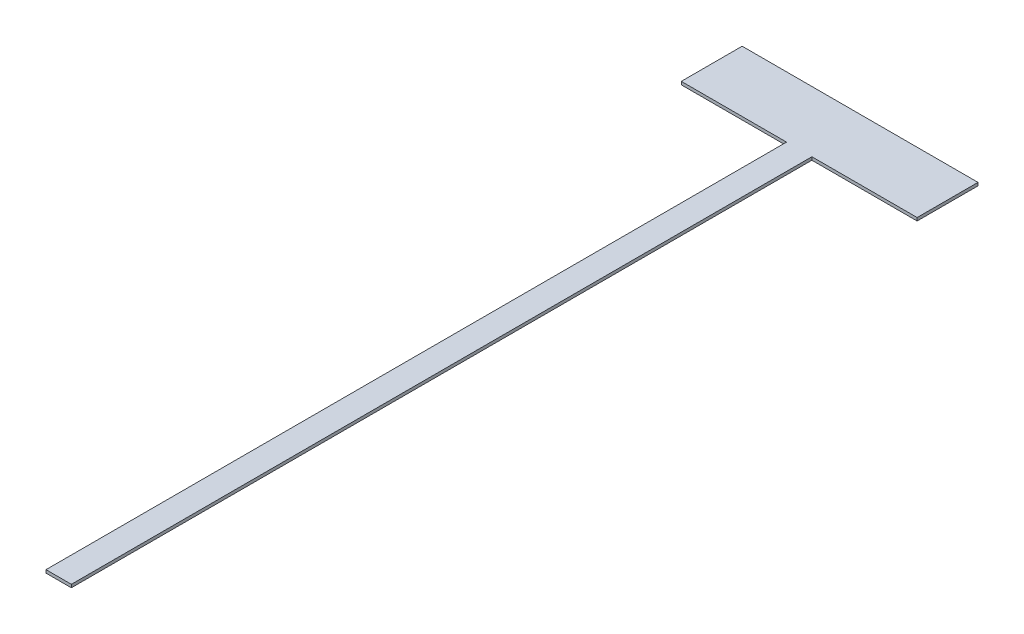
ISO-10303-21;
HEADER;
FILE_DESCRIPTION(('STEP AP214'),'2;1');
FILE_NAME('part.step','',(''),(''),'','','');
FILE_SCHEMA(('AUTOMOTIVE_DESIGN { 1 0 10303 214 1 1 1 1 }'));
ENDSEC;
DATA;
#1=APPLICATION_CONTEXT('core data for automotive mechanical design processes');
#2=APPLICATION_PROTOCOL_DEFINITION('international standard','automotive_design',2000,#1);
#3=PRODUCT_CONTEXT('',#1,'mechanical');
#4=PRODUCT('Part','Part','',(#3));
#5=PRODUCT_RELATED_PRODUCT_CATEGORY('part','',(#4));
#6=PRODUCT_DEFINITION_FORMATION('','',#4);
#7=PRODUCT_DEFINITION_CONTEXT('part definition',#1,'design');
#8=PRODUCT_DEFINITION('design','',#6,#7);
#9=PRODUCT_DEFINITION_SHAPE('','',#8);
#10=(LENGTH_UNIT() NAMED_UNIT(*) SI_UNIT(.MILLI.,.METRE.));
#11=(NAMED_UNIT(*) PLANE_ANGLE_UNIT() SI_UNIT($,.RADIAN.));
#12=(NAMED_UNIT(*) SI_UNIT($,.STERADIAN.) SOLID_ANGLE_UNIT());
#13=UNCERTAINTY_MEASURE_WITH_UNIT(LENGTH_MEASURE(1.E-05),#10,'distance_accuracy_value','');
#14=(GEOMETRIC_REPRESENTATION_CONTEXT(3) GLOBAL_UNCERTAINTY_ASSIGNED_CONTEXT((#13)) GLOBAL_UNIT_ASSIGNED_CONTEXT((#10,
#11,#12)) REPRESENTATION_CONTEXT('',''));
#15=CARTESIAN_POINT('',(0.,0.,0.));
#16=DIRECTION('',(0.,0.,1.));
#17=DIRECTION('',(1.,0.,0.));
#18=AXIS2_PLACEMENT_3D('',#15,#16,#17);
#19=CARTESIAN_POINT('',(46.5,1.2,-24.));
#20=DIRECTION('',(0.,0.,1.));
#21=DIRECTION('',(1.,0.,0.));
#22=AXIS2_PLACEMENT_3D('',#19,#20,#21);
#23=PLANE('',#22);
#24=DIRECTION('',(-1.,0.,0.));
#25=VECTOR('',#24,1.);
#26=CARTESIAN_POINT('',(46.5,0.,-24.));
#27=LINE('',#26,#25);
#28=CARTESIAN_POINT('',(46.5,0.,-24.));
#29=VERTEX_POINT('',#28);
#30=CARTESIAN_POINT('',(-46.5,0.,-24.));
#31=VERTEX_POINT('',#30);
#32=EDGE_CURVE('E135',#29,#31,#27,.T.);
#33=ORIENTED_EDGE('',*,*,#32,.T.);
#34=DIRECTION('',(0.,-1.,0.));
#35=VECTOR('',#34,1.);
#36=CARTESIAN_POINT('',(-46.5,1.2,-24.));
#37=LINE('',#36,#35);
#38=CARTESIAN_POINT('',(-46.5,1.2,-24.));
#39=VERTEX_POINT('',#38);
#40=EDGE_CURVE('E11',#39,#31,#37,.T.);
#41=ORIENTED_EDGE('',*,*,#40,.F.);
#42=DIRECTION('',(-1.,0.,0.));
#43=VECTOR('',#42,1.);
#44=CARTESIAN_POINT('',(46.5,1.2,-24.));
#45=LINE('',#44,#43);
#46=CARTESIAN_POINT('',(46.5,1.2,-24.));
#47=VERTEX_POINT('',#46);
#48=EDGE_CURVE('E149',#47,#39,#45,.T.);
#49=ORIENTED_EDGE('',*,*,#48,.F.);
#50=DIRECTION('',(0.,-1.,0.));
#51=VECTOR('',#50,1.);
#52=CARTESIAN_POINT('',(46.5,1.2,-24.));
#53=LINE('',#52,#51);
#54=EDGE_CURVE('E131',#47,#29,#53,.T.);
#55=ORIENTED_EDGE('',*,*,#54,.T.);
#56=EDGE_LOOP('',(#33,#41,#49,#55));
#57=FACE_BOUND('',#56,.T.);
#58=ADVANCED_FACE('F39',(#57),#23,.F.);
#59=CARTESIAN_POINT('',(-46.5,1.2,-24.));
#60=DIRECTION('',(1.,0.,0.));
#61=DIRECTION('',(0.,0.,-1.));
#62=AXIS2_PLACEMENT_3D('',#59,#60,#61);
#63=PLANE('',#62);
#64=DIRECTION('',(0.,0.,1.));
#65=VECTOR('',#64,1.);
#66=CARTESIAN_POINT('',(-46.5,0.,-24.));
#67=LINE('',#66,#65);
#68=CARTESIAN_POINT('',(-46.5,0.,0.));
#69=VERTEX_POINT('',#68);
#70=EDGE_CURVE('E138',#31,#69,#67,.T.);
#71=ORIENTED_EDGE('',*,*,#70,.T.);
#72=DIRECTION('',(0.,-1.,0.));
#73=VECTOR('',#72,1.);
#74=CARTESIAN_POINT('',(-46.5,1.2,0.));
#75=LINE('',#74,#73);
#76=CARTESIAN_POINT('',(-46.5,1.2,0.));
#77=VERTEX_POINT('',#76);
#78=EDGE_CURVE('E47',#77,#69,#75,.T.);
#79=ORIENTED_EDGE('',*,*,#78,.F.);
#80=DIRECTION('',(0.,0.,1.));
#81=VECTOR('',#80,1.);
#82=CARTESIAN_POINT('',(-46.5,1.2,-24.));
#83=LINE('',#82,#81);
#84=EDGE_CURVE('E98',#39,#77,#83,.T.);
#85=ORIENTED_EDGE('',*,*,#84,.F.);
#86=ORIENTED_EDGE('',*,*,#40,.T.);
#87=EDGE_LOOP('',(#71,#79,#85,#86));
#88=FACE_BOUND('',#87,.T.);
#89=ADVANCED_FACE('F184',(#88),#63,.F.);
#90=CARTESIAN_POINT('',(-46.5,1.2,0.));
#91=DIRECTION('',(0.,0.,-1.));
#92=DIRECTION('',(-1.,0.,0.));
#93=AXIS2_PLACEMENT_3D('',#90,#91,#92);
#94=PLANE('',#93);
#95=DIRECTION('',(1.,0.,0.));
#96=VECTOR('',#95,1.);
#97=CARTESIAN_POINT('',(-46.5,0.,0.));
#98=LINE('',#97,#96);
#99=CARTESIAN_POINT('',(-5.00000000000003,0.,0.));
#100=VERTEX_POINT('',#99);
#101=EDGE_CURVE('E140',#69,#100,#98,.T.);
#102=ORIENTED_EDGE('',*,*,#101,.T.);
#103=DIRECTION('',(0.,-1.,0.));
#104=VECTOR('',#103,1.);
#105=CARTESIAN_POINT('',(-5.00000000000003,1.2,0.));
#106=LINE('',#105,#104);
#107=CARTESIAN_POINT('',(-5.00000000000003,1.2,0.));
#108=VERTEX_POINT('',#107);
#109=EDGE_CURVE('E156',#108,#100,#106,.T.);
#110=ORIENTED_EDGE('',*,*,#109,.F.);
#111=DIRECTION('',(1.,0.,0.));
#112=VECTOR('',#111,1.);
#113=CARTESIAN_POINT('',(-46.5,1.2,0.));
#114=LINE('',#113,#112);
#115=EDGE_CURVE('E164',#77,#108,#114,.T.);
#116=ORIENTED_EDGE('',*,*,#115,.F.);
#117=ORIENTED_EDGE('',*,*,#78,.T.);
#118=EDGE_LOOP('',(#102,#110,#116,#117));
#119=FACE_BOUND('',#118,.T.);
#120=ADVANCED_FACE('F162',(#119),#94,.F.);
#121=CARTESIAN_POINT('',(-5.00000000000003,1.2,0.));
#122=DIRECTION('',(1.,0.,0.));
#123=DIRECTION('',(0.,0.,-1.));
#124=AXIS2_PLACEMENT_3D('',#121,#122,#123);
#125=PLANE('',#124);
#126=DIRECTION('',(0.,0.,1.));
#127=VECTOR('',#126,1.);
#128=CARTESIAN_POINT('',(-5.00000000000003,0.,0.));
#129=LINE('',#128,#127);
#130=CARTESIAN_POINT('',(-5.,0.,292.));
#131=VERTEX_POINT('',#130);
#132=EDGE_CURVE('E142',#100,#131,#129,.T.);
#133=ORIENTED_EDGE('',*,*,#132,.T.);
#134=DIRECTION('',(0.,-1.,0.));
#135=VECTOR('',#134,1.);
#136=CARTESIAN_POINT('',(-5.,1.2,292.));
#137=LINE('',#136,#135);
#138=CARTESIAN_POINT('',(-5.,1.2,292.));
#139=VERTEX_POINT('',#138);
#140=EDGE_CURVE('E153',#139,#131,#137,.T.);
#141=ORIENTED_EDGE('',*,*,#140,.F.);
#142=DIRECTION('',(0.,0.,1.));
#143=VECTOR('',#142,1.);
#144=CARTESIAN_POINT('',(-5.00000000000003,1.2,0.));
#145=LINE('',#144,#143);
#146=EDGE_CURVE('E176',#108,#139,#145,.T.);
#147=ORIENTED_EDGE('',*,*,#146,.F.);
#148=ORIENTED_EDGE('',*,*,#109,.T.);
#149=EDGE_LOOP('',(#133,#141,#147,#148));
#150=FACE_BOUND('',#149,.T.);
#151=ADVANCED_FACE('F172',(#150),#125,.F.);
#152=CARTESIAN_POINT('',(-5.,1.2,292.));
#153=DIRECTION('',(0.,0.,-1.));
#154=DIRECTION('',(-1.,0.,0.));
#155=AXIS2_PLACEMENT_3D('',#152,#153,#154);
#156=PLANE('',#155);
#157=DIRECTION('',(1.,0.,0.));
#158=VECTOR('',#157,1.);
#159=CARTESIAN_POINT('',(-5.,0.,292.));
#160=LINE('',#159,#158);
#161=CARTESIAN_POINT('',(5.,0.,292.));
#162=VERTEX_POINT('',#161);
#163=EDGE_CURVE('E144',#131,#162,#160,.T.);
#164=ORIENTED_EDGE('',*,*,#163,.T.);
#165=DIRECTION('',(0.,-1.,0.));
#166=VECTOR('',#165,1.);
#167=CARTESIAN_POINT('',(5.,1.2,292.));
#168=LINE('',#167,#166);
#169=CARTESIAN_POINT('',(5.,1.2,292.));
#170=VERTEX_POINT('',#169);
#171=EDGE_CURVE('E126',#170,#162,#168,.T.);
#172=ORIENTED_EDGE('',*,*,#171,.F.);
#173=DIRECTION('',(1.,0.,0.));
#174=VECTOR('',#173,1.);
#175=CARTESIAN_POINT('',(-5.,1.2,292.));
#176=LINE('',#175,#174);
#177=EDGE_CURVE('E117',#139,#170,#176,.T.);
#178=ORIENTED_EDGE('',*,*,#177,.F.);
#179=ORIENTED_EDGE('',*,*,#140,.T.);
#180=EDGE_LOOP('',(#164,#172,#178,#179));
#181=FACE_BOUND('',#180,.T.);
#182=ADVANCED_FACE('F175',(#181),#156,.F.);
#183=CARTESIAN_POINT('',(5.,1.2,292.));
#184=DIRECTION('',(-1.,0.,0.));
#185=DIRECTION('',(0.,0.,1.));
#186=AXIS2_PLACEMENT_3D('',#183,#184,#185);
#187=PLANE('',#186);
#188=DIRECTION('',(0.,0.,-1.));
#189=VECTOR('',#188,1.);
#190=CARTESIAN_POINT('',(5.,0.,292.));
#191=LINE('',#190,#189);
#192=CARTESIAN_POINT('',(5.00000000000003,0.,0.));
#193=VERTEX_POINT('',#192);
#194=EDGE_CURVE('E125',#162,#193,#191,.T.);
#195=ORIENTED_EDGE('',*,*,#194,.T.);
#196=DIRECTION('',(0.,-1.,0.));
#197=VECTOR('',#196,1.);
#198=CARTESIAN_POINT('',(5.00000000000003,1.2,0.));
#199=LINE('',#198,#197);
#200=CARTESIAN_POINT('',(5.00000000000003,1.2,0.));
#201=VERTEX_POINT('',#200);
#202=EDGE_CURVE('E122',#201,#193,#199,.T.);
#203=ORIENTED_EDGE('',*,*,#202,.F.);
#204=DIRECTION('',(0.,0.,-1.));
#205=VECTOR('',#204,1.);
#206=CARTESIAN_POINT('',(5.,1.2,292.));
#207=LINE('',#206,#205);
#208=EDGE_CURVE('E111',#170,#201,#207,.T.);
#209=ORIENTED_EDGE('',*,*,#208,.F.);
#210=ORIENTED_EDGE('',*,*,#171,.T.);
#211=EDGE_LOOP('',(#195,#203,#209,#210));
#212=FACE_BOUND('',#211,.T.);
#213=ADVANCED_FACE('F123',(#212),#187,.F.);
#214=CARTESIAN_POINT('',(5.00000000000003,1.2,0.));
#215=DIRECTION('',(0.,0.,-1.));
#216=DIRECTION('',(-1.,0.,0.));
#217=AXIS2_PLACEMENT_3D('',#214,#215,#216);
#218=PLANE('',#217);
#219=DIRECTION('',(1.,0.,0.));
#220=VECTOR('',#219,1.);
#221=CARTESIAN_POINT('',(5.00000000000003,0.,0.));
#222=LINE('',#221,#220);
#223=CARTESIAN_POINT('',(46.5,0.,0.));
#224=VERTEX_POINT('',#223);
#225=EDGE_CURVE('E84',#193,#224,#222,.T.);
#226=ORIENTED_EDGE('',*,*,#225,.T.);
#227=DIRECTION('',(0.,-1.,0.));
#228=VECTOR('',#227,1.);
#229=CARTESIAN_POINT('',(46.5,1.2,0.));
#230=LINE('',#229,#228);
#231=CARTESIAN_POINT('',(46.5,1.2,0.));
#232=VERTEX_POINT('',#231);
#233=EDGE_CURVE('E127',#232,#224,#230,.T.);
#234=ORIENTED_EDGE('',*,*,#233,.F.);
#235=DIRECTION('',(1.,0.,0.));
#236=VECTOR('',#235,1.);
#237=CARTESIAN_POINT('',(5.00000000000003,1.2,0.));
#238=LINE('',#237,#236);
#239=EDGE_CURVE('E115',#201,#232,#238,.T.);
#240=ORIENTED_EDGE('',*,*,#239,.F.);
#241=ORIENTED_EDGE('',*,*,#202,.T.);
#242=EDGE_LOOP('',(#226,#234,#240,#241));
#243=FACE_BOUND('',#242,.T.);
#244=ADVANCED_FACE('F129',(#243),#218,.F.);
#245=CARTESIAN_POINT('',(46.5,1.2,0.));
#246=DIRECTION('',(-1.,0.,0.));
#247=DIRECTION('',(0.,0.,1.));
#248=AXIS2_PLACEMENT_3D('',#245,#246,#247);
#249=PLANE('',#248);
#250=DIRECTION('',(0.,0.,-1.));
#251=VECTOR('',#250,1.);
#252=CARTESIAN_POINT('',(46.5,0.,0.));
#253=LINE('',#252,#251);
#254=EDGE_CURVE('E90',#224,#29,#253,.T.);
#255=ORIENTED_EDGE('',*,*,#254,.T.);
#256=ORIENTED_EDGE('',*,*,#54,.F.);
#257=DIRECTION('',(0.,0.,-1.));
#258=VECTOR('',#257,1.);
#259=CARTESIAN_POINT('',(46.5,1.2,0.));
#260=LINE('',#259,#258);
#261=EDGE_CURVE('E55',#232,#47,#260,.T.);
#262=ORIENTED_EDGE('',*,*,#261,.F.);
#263=ORIENTED_EDGE('',*,*,#233,.T.);
#264=EDGE_LOOP('',(#255,#256,#262,#263));
#265=FACE_BOUND('',#264,.T.);
#266=ADVANCED_FACE('F200',(#265),#249,.F.);
#267=CARTESIAN_POINT('',(0.,1.2,0.));
#268=DIRECTION('',(0.,1.,0.));
#269=DIRECTION('',(0.,0.,1.));
#270=AXIS2_PLACEMENT_3D('',#267,#268,#269);
#271=PLANE('',#270);
#272=ORIENTED_EDGE('',*,*,#48,.T.);
#273=ORIENTED_EDGE('',*,*,#84,.T.);
#274=ORIENTED_EDGE('',*,*,#115,.T.);
#275=ORIENTED_EDGE('',*,*,#146,.T.);
#276=ORIENTED_EDGE('',*,*,#177,.T.);
#277=ORIENTED_EDGE('',*,*,#208,.T.);
#278=ORIENTED_EDGE('',*,*,#239,.T.);
#279=ORIENTED_EDGE('',*,*,#261,.T.);
#280=EDGE_LOOP('',(#272,#273,#274,#275,#276,#277,#278,#279));
#281=FACE_BOUND('',#280,.T.);
#282=ADVANCED_FACE('F113',(#281),#271,.T.);
#283=CARTESIAN_POINT('',(0.,0.,0.));
#284=DIRECTION('',(0.,1.,0.));
#285=DIRECTION('',(0.,0.,1.));
#286=AXIS2_PLACEMENT_3D('',#283,#284,#285);
#287=PLANE('',#286);
#288=ORIENTED_EDGE('',*,*,#32,.F.);
#289=ORIENTED_EDGE('',*,*,#254,.F.);
#290=ORIENTED_EDGE('',*,*,#225,.F.);
#291=ORIENTED_EDGE('',*,*,#194,.F.);
#292=ORIENTED_EDGE('',*,*,#163,.F.);
#293=ORIENTED_EDGE('',*,*,#132,.F.);
#294=ORIENTED_EDGE('',*,*,#101,.F.);
#295=ORIENTED_EDGE('',*,*,#70,.F.);
#296=EDGE_LOOP('',(#288,#289,#290,#291,#292,#293,#294,#295));
#297=FACE_BOUND('',#296,.T.);
#298=ADVANCED_FACE('F168',(#297),#287,.F.);
#299=CLOSED_SHELL('',(#58,#89,#120,#151,#182,#213,#244,#266,#282,#298));
#300=MANIFOLD_SOLID_BREP('B2',#299);
#301=ADVANCED_BREP_SHAPE_REPRESENTATION('',(#18,#300),#14);
#302=SHAPE_DEFINITION_REPRESENTATION(#9,#301);
ENDSEC;
END-ISO-10303-21;
